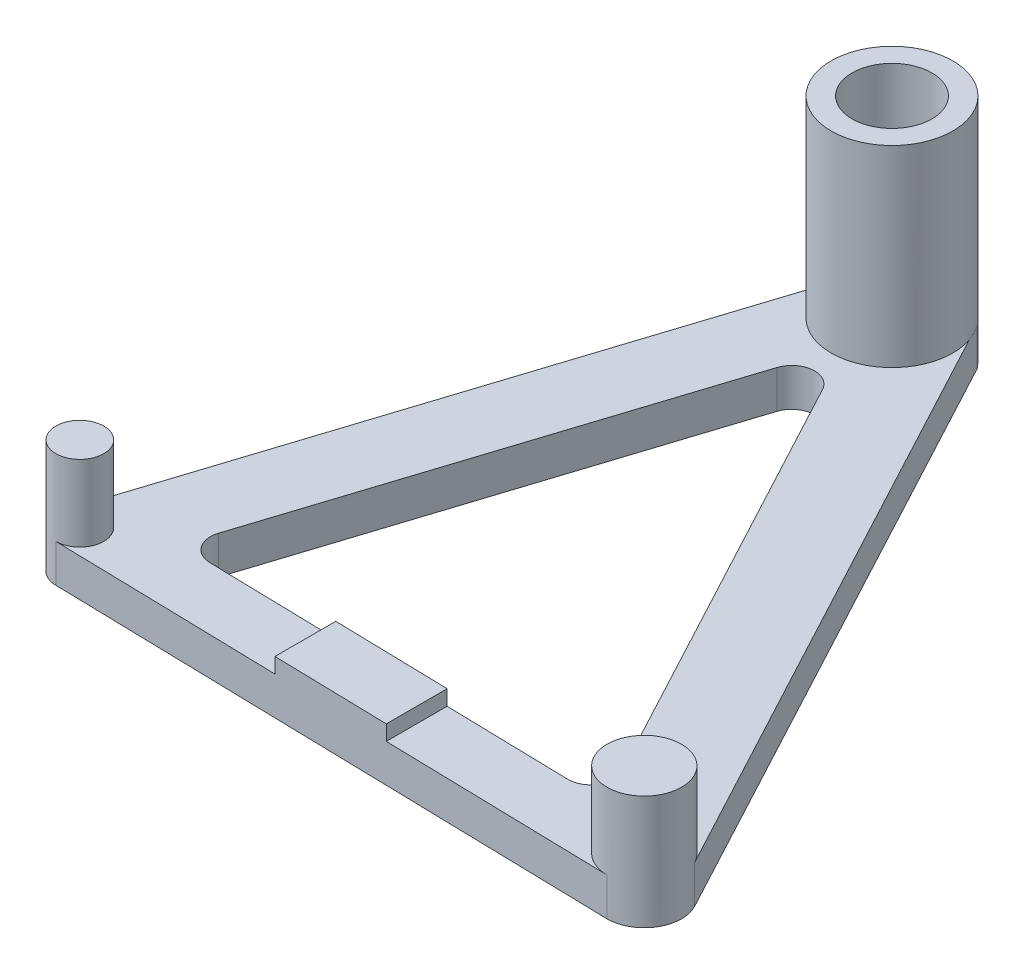
ISO-10303-21;
HEADER;
FILE_DESCRIPTION(('STEP AP214'),'2;1');
FILE_NAME('part.step','',(''),(''),'','','');
FILE_SCHEMA(('AUTOMOTIVE_DESIGN { 1 0 10303 214 1 1 1 1 }'));
ENDSEC;
DATA;
#1=APPLICATION_CONTEXT('core data for automotive mechanical design processes');
#2=APPLICATION_PROTOCOL_DEFINITION('international standard','automotive_design',2000,#1);
#3=PRODUCT_CONTEXT('',#1,'mechanical');
#4=PRODUCT('Part','Part','',(#3));
#5=PRODUCT_RELATED_PRODUCT_CATEGORY('part','',(#4));
#6=PRODUCT_DEFINITION_FORMATION('','',#4);
#7=PRODUCT_DEFINITION_CONTEXT('part definition',#1,'design');
#8=PRODUCT_DEFINITION('design','',#6,#7);
#9=PRODUCT_DEFINITION_SHAPE('','',#8);
#10=(LENGTH_UNIT() NAMED_UNIT(*) SI_UNIT(.MILLI.,.METRE.));
#11=(NAMED_UNIT(*) PLANE_ANGLE_UNIT() SI_UNIT($,.RADIAN.));
#12=(NAMED_UNIT(*) SI_UNIT($,.STERADIAN.) SOLID_ANGLE_UNIT());
#13=UNCERTAINTY_MEASURE_WITH_UNIT(LENGTH_MEASURE(1.E-05),#10,'distance_accuracy_value','');
#14=(GEOMETRIC_REPRESENTATION_CONTEXT(3) GLOBAL_UNCERTAINTY_ASSIGNED_CONTEXT((#13)) GLOBAL_UNIT_ASSIGNED_CONTEXT((#10,
#11,#12)) REPRESENTATION_CONTEXT('',''));
#15=CARTESIAN_POINT('',(0.,0.,0.));
#16=DIRECTION('',(0.,0.,1.));
#17=DIRECTION('',(1.,0.,0.));
#18=AXIS2_PLACEMENT_3D('',#15,#16,#17);
#19=CARTESIAN_POINT('',(0.,0.,0.));
#20=DIRECTION('',(0.,-1.,0.));
#21=DIRECTION('',(0.,0.,-1.));
#22=AXIS2_PLACEMENT_3D('',#19,#20,#21);
#23=PLANE('',#22);
#24=DIRECTION('',(0.,0.,1.));
#25=VECTOR('',#24,1.);
#26=CARTESIAN_POINT('',(-0.0266867237949386,0.,73.1403026304612));
#27=LINE('',#26,#25);
#28=CARTESIAN_POINT('',(-0.0266867237949386,0.,73.1403026304612));
#29=VERTEX_POINT('',#28);
#30=CARTESIAN_POINT('',(-0.0266867237949317,0.,81.1447466214371));
#31=VERTEX_POINT('',#30);
#32=EDGE_CURVE('E359',#29,#31,#27,.T.);
#33=ORIENTED_EDGE('',*,*,#32,.F.);
#34=DIRECTION('',(0.999722366227584,0.,0.0235624800120976));
#35=VECTOR('',#34,1.);
#36=CARTESIAN_POINT('',(36.3308666477732,0.,73.9972146627877));
#37=LINE('',#36,#35);
#38=CARTESIAN_POINT('',(-16.9948169162054,0.,72.740380370034));
#39=VERTEX_POINT('',#38);
#40=EDGE_CURVE('E160',#39,#29,#37,.T.);
#41=ORIENTED_EDGE('',*,*,#40,.F.);
#42=CARTESIAN_POINT('',(-16.9241294761691,0.,69.7412132713512));
#43=DIRECTION('',(0.,-1.,0.));
#44=DIRECTION('',(0.,0.,-1.));
#45=AXIS2_PLACEMENT_3D('',#42,#43,#44);
#46=CIRCLE('',#45,3.);
#47=CARTESIAN_POINT('',(-19.7806027640925,0.,68.8243924844031));
#48=VERTEX_POINT('',#47);
#49=EDGE_CURVE('E48',#39,#48,#46,.T.);
#50=ORIENTED_EDGE('',*,*,#49,.T.);
#51=DIRECTION('',(0.305606928982731,0.,-0.952157762641121));
#52=VECTOR('',#51,1.);
#53=CARTESIAN_POINT('',(2.09375374370878,0.,0.672016420772603));
#54=LINE('',#53,#52);
#55=CARTESIAN_POINT('',(-1.92874610163748,0.,13.2046329609741));
#56=VERTEX_POINT('',#55);
#57=EDGE_CURVE('E339',#48,#56,#54,.T.);
#58=ORIENTED_EDGE('',*,*,#57,.T.);
#59=CARTESIAN_POINT('',(0.927727186285879,0.,14.1214537479223));
#60=DIRECTION('',(0.,-1.,0.));
#61=DIRECTION('',(0.,0.,-1.));
#62=AXIS2_PLACEMENT_3D('',#59,#60,#61);
#63=CIRCLE('',#62,3.);
#64=CARTESIAN_POINT('',(3.57354097258041,0.,12.7073570722124));
#65=VERTEX_POINT('',#64);
#66=EDGE_CURVE('E76',#56,#65,#63,.T.);
#67=ORIENTED_EDGE('',*,*,#66,.T.);
#68=DIRECTION('',(-0.471365558569963,0.,-0.881937928764846));
#69=VECTOR('',#68,1.);
#70=CARTESIAN_POINT('',(0.235470884255557,0.,6.46173609663541));
#71=LINE('',#70,#69);
#72=CARTESIAN_POINT('',(33.9073810423125,0.,69.4628064176121));
#73=VERTEX_POINT('',#72);
#74=EDGE_CURVE('E140',#73,#65,#71,.T.);
#75=ORIENTED_EDGE('',*,*,#74,.F.);
#76=CARTESIAN_POINT('',(31.2615672560179,0.,70.876903093322));
#77=DIRECTION('',(0.,-1.,0.));
#78=DIRECTION('',(0.,0.,-1.));
#79=AXIS2_PLACEMENT_3D('',#76,#77,#78);
#80=CIRCLE('',#79,3.);
#81=CARTESIAN_POINT('',(31.1908798159816,0.,73.8760701920047));
#82=VERTEX_POINT('',#81);
#83=EDGE_CURVE('E134',#73,#82,#80,.T.);
#84=ORIENTED_EDGE('',*,*,#83,.T.);
#85=CARTESIAN_POINT('',(14.9733132762051,0.,73.4938379839965));
#86=VERTEX_POINT('',#85);
#87=EDGE_CURVE('E62',#86,#82,#37,.T.);
#88=ORIENTED_EDGE('',*,*,#87,.F.);
#89=DIRECTION('',(0.,0.,-1.));
#90=VECTOR('',#89,1.);
#91=CARTESIAN_POINT('',(14.9733132762051,0.,81.4982819749725));
#92=LINE('',#91,#90);
#93=CARTESIAN_POINT('',(14.9733132762051,0.,81.4982819749725));
#94=VERTEX_POINT('',#93);
#95=EDGE_CURVE('E352',#94,#86,#92,.T.);
#96=ORIENTED_EDGE('',*,*,#95,.F.);
#97=DIRECTION('',(0.999722366227584,0.,0.0235624800120979));
#98=VECTOR('',#97,1.);
#99=CARTESIAN_POINT('',(-1.91145545871687,0.,81.1003244627016));
#100=LINE('',#99,#98);
#101=CARTESIAN_POINT('',(44.4828891786728,0.,82.1937938649296));
#102=VERTEX_POINT('',#101);
#103=EDGE_CURVE('E42',#94,#102,#100,.T.);
#104=ORIENTED_EDGE('',*,*,#103,.T.);
#105=CARTESIAN_POINT('',(44.7137373737374,0.,77.29923473148));
#106=DIRECTION('',(0.,1.,0.));
#107=DIRECTION('',(0.,0.,1.));
#108=AXIS2_PLACEMENT_3D('',#105,#106,#107);
#109=CIRCLE('',#108,4.9);
#110=CARTESIAN_POINT('',(49.0352332246851,0.,74.9895434944872));
#111=VERTEX_POINT('',#110);
#112=EDGE_CURVE('E223',#111,#102,#109,.T.);
#113=ORIENTED_EDGE('',*,*,#112,.F.);
#114=DIRECTION('',(-0.471365558569963,0.,-0.881937928764846));
#115=VECTOR('',#114,1.);
#116=CARTESIAN_POINT('',(6.96602550959596,0.,-3.72310159054154));
#117=LINE('',#116,#115);
#118=CARTESIAN_POINT('',(7.56467891022886,0.,-2.60300460720657));
#119=VERTEX_POINT('',#118);
#120=EDGE_CURVE('E202',#111,#119,#117,.T.);
#121=ORIENTED_EDGE('',*,*,#120,.T.);
#122=CARTESIAN_POINT('',(0.,0.,0.));
#123=DIRECTION('',(0.,-1.,0.));
#124=DIRECTION('',(0.,0.,-1.));
#125=AXIS2_PLACEMENT_3D('',#122,#123,#124);
#126=CIRCLE('',#125,8.);
#127=CARTESIAN_POINT('',(-7.99925115845216,0.,-0.109457315889754));
#128=VERTEX_POINT('',#127);
#129=EDGE_CURVE('E244',#128,#119,#126,.F.);
#130=ORIENTED_EDGE('',*,*,#129,.F.);
#131=DIRECTION('',(0.305606928982731,0.,-0.95215776264112));
#132=VECTOR('',#131,1.);
#133=CARTESIAN_POINT('',(-7.28400688420454,0.,-2.33789300671788));
#134=LINE('',#133,#132);
#135=CARTESIAN_POINT('',(-32.5355595785822,0.,76.3365729051844));
#136=VERTEX_POINT('',#135);
#137=EDGE_CURVE('E186',#136,#128,#134,.T.);
#138=ORIENTED_EDGE('',*,*,#137,.F.);
#139=CARTESIAN_POINT('',(-29.5362626262627,0.,77.29923473148));
#140=DIRECTION('',(0.,1.,0.));
#141=DIRECTION('',(0.,0.,1.));
#142=AXIS2_PLACEMENT_3D('',#139,#140,#141);
#143=CIRCLE('',#142,3.15);
#144=CARTESIAN_POINT('',(-29.5362626262627,0.,80.44923473148));
#145=VERTEX_POINT('',#144);
#146=EDGE_CURVE('E176',#145,#136,#143,.T.);
#147=ORIENTED_EDGE('',*,*,#146,.F.);
#148=EDGE_CURVE('E207',#145,#31,#100,.T.);
#149=ORIENTED_EDGE('',*,*,#148,.T.);
#150=EDGE_LOOP('',(#33,#41,#50,#58,#67,#75,#84,#88,#96,#104,#113,#121,#130,#138,#147,#149));
#151=FACE_BOUND('',#150,.T.);
#152=ADVANCED_FACE('F38',(#151),#23,.F.);
#153=CARTESIAN_POINT('',(44.7137373737374,25.3,77.29923473148));
#154=DIRECTION('',(0.,-1.,0.));
#155=DIRECTION('',(0.,0.,-1.));
#156=AXIS2_PLACEMENT_3D('',#153,#154,#155);
#157=CYLINDRICAL_SURFACE('',#156,4.9);
#158=CARTESIAN_POINT('',(44.7137373737374,10.,77.29923473148));
#159=DIRECTION('',(0.,-1.,0.));
#160=DIRECTION('',(0.,0.,-1.));
#161=AXIS2_PLACEMENT_3D('',#158,#159,#160);
#162=CIRCLE('',#161,4.9);
#163=CARTESIAN_POINT('',(44.7137373737374,10.,72.39923473148));
#164=VERTEX_POINT('',#163);
#165=EDGE_CURVE('E166',#164,#164,#162,.T.);
#166=ORIENTED_EDGE('',*,*,#165,.T.);
#167=EDGE_LOOP('',(#166));
#168=FACE_BOUND('',#167,.T.);
#169=CARTESIAN_POINT('',(44.7137373737374,0.,77.29923473148));
#170=DIRECTION('',(0.,1.,0.));
#171=DIRECTION('',(-0.0471118765437864,0.,0.998889619071358));
#172=AXIS2_PLACEMENT_3D('',#169,#170,#171);
#173=CIRCLE('',#172,4.90000000000001);
#174=CARTESIAN_POINT('',(44.7137373737374,0.,82.19923473148));
#175=VERTEX_POINT('',#174);
#176=EDGE_CURVE('E232',#102,#175,#173,.T.);
#177=ORIENTED_EDGE('',*,*,#176,.T.);
#178=DIRECTION('',(0.,1.,0.));
#179=VECTOR('',#178,1.);
#180=CARTESIAN_POINT('',(44.7137373737374,-5.,82.19923473148));
#181=LINE('',#180,#179);
#182=CARTESIAN_POINT('',(44.7137373737374,-5.,82.19923473148));
#183=VERTEX_POINT('',#182);
#184=EDGE_CURVE('E219',#183,#175,#181,.T.);
#185=ORIENTED_EDGE('',*,*,#184,.F.);
#186=CARTESIAN_POINT('',(44.7137373737374,-5.,77.29923473148));
#187=DIRECTION('',(0.,-1.,0.));
#188=DIRECTION('',(0.,0.,-1.));
#189=AXIS2_PLACEMENT_3D('',#186,#187,#188);
#190=CIRCLE('',#189,4.90000000000001);
#191=CARTESIAN_POINT('',(49.0352332246851,-5.,74.9895434944872));
#192=VERTEX_POINT('',#191);
#193=EDGE_CURVE('E185',#192,#183,#190,.T.);
#194=ORIENTED_EDGE('',*,*,#193,.F.);
#195=DIRECTION('',(0.,1.,0.));
#196=VECTOR('',#195,1.);
#197=CARTESIAN_POINT('',(49.0352332246851,-5.,74.9895434944872));
#198=LINE('',#197,#196);
#199=EDGE_CURVE('E220',#192,#111,#198,.T.);
#200=ORIENTED_EDGE('',*,*,#199,.T.);
#201=ORIENTED_EDGE('',*,*,#112,.T.);
#202=EDGE_LOOP('',(#177,#185,#194,#200,#201));
#203=FACE_BOUND('',#202,.T.);
#204=ADVANCED_FACE('F246',(#168,#203),#157,.T.);
#205=CARTESIAN_POINT('',(6.96602550959596,-5.,-3.72310159054154));
#206=DIRECTION('',(0.881937928764846,0.,-0.471365558569963));
#207=DIRECTION('',(-0.471365558569963,0.,-0.881937928764846));
#208=AXIS2_PLACEMENT_3D('',#205,#206,#207);
#209=PLANE('',#208);
#210=ORIENTED_EDGE('',*,*,#120,.F.);
#211=ORIENTED_EDGE('',*,*,#199,.F.);
#212=DIRECTION('',(-0.471365558569963,0.,-0.881937928764846));
#213=VECTOR('',#212,1.);
#214=CARTESIAN_POINT('',(6.96602550959596,-5.,-3.72310159054154));
#215=LINE('',#214,#213);
#216=CARTESIAN_POINT('',(6.36737210896305,-5.,-4.84319857387651));
#217=VERTEX_POINT('',#216);
#218=EDGE_CURVE('E182',#192,#217,#215,.T.);
#219=ORIENTED_EDGE('',*,*,#218,.T.);
#220=DIRECTION('',(0.,1.,0.));
#221=VECTOR('',#220,1.);
#222=CARTESIAN_POINT('',(6.36737210896305,-5.,-4.84319857387651));
#223=LINE('',#222,#221);
#224=CARTESIAN_POINT('',(6.36737210896305,0.,-4.84319857387651));
#225=VERTEX_POINT('',#224);
#226=EDGE_CURVE('E201',#217,#225,#223,.T.);
#227=ORIENTED_EDGE('',*,*,#226,.T.);
#228=EDGE_CURVE('E181',#119,#225,#117,.T.);
#229=ORIENTED_EDGE('',*,*,#228,.F.);
#230=EDGE_LOOP('',(#210,#211,#219,#227,#229));
#231=FACE_BOUND('',#230,.T.);
#232=ADVANCED_FACE('F256',(#231),#209,.T.);
#233=CARTESIAN_POINT('',(-1.91145545871687,-5.,81.1003244627016));
#234=DIRECTION('',(-0.0235624800120979,0.,0.999722366227584));
#235=DIRECTION('',(0.999722366227584,0.,0.0235624800120979));
#236=AXIS2_PLACEMENT_3D('',#233,#234,#235);
#237=PLANE('',#236);
#238=ORIENTED_EDGE('',*,*,#148,.F.);
#239=DIRECTION('',(0.,1.,0.));
#240=VECTOR('',#239,1.);
#241=CARTESIAN_POINT('',(-29.5362626262627,-5.,80.44923473148));
#242=LINE('',#241,#240);
#243=CARTESIAN_POINT('',(-29.5362626262627,-5.,80.44923473148));
#244=VERTEX_POINT('',#243);
#245=EDGE_CURVE('E216',#244,#145,#242,.T.);
#246=ORIENTED_EDGE('',*,*,#245,.F.);
#247=DIRECTION('',(0.999722366227584,0.,0.0235624800120979));
#248=VECTOR('',#247,1.);
#249=CARTESIAN_POINT('',(-1.91145545871687,-5.,81.1003244627016));
#250=LINE('',#249,#248);
#251=EDGE_CURVE('E189',#244,#183,#250,.T.);
#252=ORIENTED_EDGE('',*,*,#251,.T.);
#253=ORIENTED_EDGE('',*,*,#184,.T.);
#254=ORIENTED_EDGE('',*,*,#176,.F.);
#255=ORIENTED_EDGE('',*,*,#103,.F.);
#256=DIRECTION('',(0.,-1.,0.));
#257=VECTOR('',#256,1.);
#258=CARTESIAN_POINT('',(14.9733132762051,2.,81.4982819749725));
#259=LINE('',#258,#257);
#260=CARTESIAN_POINT('',(14.9733132762051,2.,81.4982819749725));
#261=VERTEX_POINT('',#260);
#262=EDGE_CURVE('E156',#261,#94,#259,.T.);
#263=ORIENTED_EDGE('',*,*,#262,.F.);
#264=DIRECTION('',(0.999722366227584,0.,0.0235624800120981));
#265=VECTOR('',#264,1.);
#266=CARTESIAN_POINT('',(-0.0266867237949317,2.,81.1447466214371));
#267=LINE('',#266,#265);
#268=CARTESIAN_POINT('',(-0.0266867237949317,2.,81.1447466214371));
#269=VERTEX_POINT('',#268);
#270=EDGE_CURVE('E367',#269,#261,#267,.T.);
#271=ORIENTED_EDGE('',*,*,#270,.F.);
#272=DIRECTION('',(0.,-1.,0.));
#273=VECTOR('',#272,1.);
#274=CARTESIAN_POINT('',(-0.0266867237949317,2.,81.1447466214371));
#275=LINE('',#274,#273);
#276=EDGE_CURVE('E147',#269,#31,#275,.T.);
#277=ORIENTED_EDGE('',*,*,#276,.T.);
#278=EDGE_LOOP('',(#238,#246,#252,#253,#254,#255,#263,#271,#277));
#279=FACE_BOUND('',#278,.T.);
#280=ADVANCED_FACE('F286',(#279),#237,.T.);
#281=CARTESIAN_POINT('',(-29.5362626262627,-5.,77.29923473148));
#282=DIRECTION('',(0.,1.,0.));
#283=DIRECTION('',(0.,0.,1.));
#284=AXIS2_PLACEMENT_3D('',#281,#282,#283);
#285=CYLINDRICAL_SURFACE('',#284,3.15);
#286=CARTESIAN_POINT('',(-29.5362626262627,10.,77.29923473148));
#287=DIRECTION('',(0.,-1.,0.));
#288=DIRECTION('',(0.,0.,-1.));
#289=AXIS2_PLACEMENT_3D('',#286,#287,#288);
#290=CIRCLE('',#289,3.15);
#291=CARTESIAN_POINT('',(-29.5362626262627,10.,74.14923473148));
#292=VERTEX_POINT('',#291);
#293=EDGE_CURVE('E165',#292,#292,#290,.T.);
#294=ORIENTED_EDGE('',*,*,#293,.T.);
#295=EDGE_LOOP('',(#294));
#296=FACE_BOUND('',#295,.T.);
#297=ORIENTED_EDGE('',*,*,#245,.T.);
#298=ORIENTED_EDGE('',*,*,#146,.T.);
#299=DIRECTION('',(0.,1.,0.));
#300=VECTOR('',#299,1.);
#301=CARTESIAN_POINT('',(-32.5355595785822,-5.,76.3365729051844));
#302=LINE('',#301,#300);
#303=CARTESIAN_POINT('',(-32.5355595785822,-5.,76.3365729051844));
#304=VERTEX_POINT('',#303);
#305=EDGE_CURVE('E213',#304,#136,#302,.T.);
#306=ORIENTED_EDGE('',*,*,#305,.F.);
#307=CARTESIAN_POINT('',(-29.5362626262627,-5.,77.29923473148));
#308=DIRECTION('',(0.,-1.,0.));
#309=DIRECTION('',(0.,0.,-1.));
#310=AXIS2_PLACEMENT_3D('',#307,#308,#309);
#311=CIRCLE('',#310,3.15);
#312=EDGE_CURVE('E192',#244,#304,#311,.T.);
#313=ORIENTED_EDGE('',*,*,#312,.F.);
#314=EDGE_LOOP('',(#297,#298,#306,#313));
#315=FACE_BOUND('',#314,.T.);
#316=ADVANCED_FACE('F283',(#296,#315),#285,.T.);
#317=CARTESIAN_POINT('',(-7.28400688420454,-5.,-2.33789300671788));
#318=DIRECTION('',(0.95215776264112,0.,0.305606928982731));
#319=DIRECTION('',(0.305606928982731,0.,-0.95215776264112));
#320=AXIS2_PLACEMENT_3D('',#317,#318,#319);
#321=PLANE('',#320);
#322=ORIENTED_EDGE('',*,*,#137,.T.);
#323=DIRECTION('',(0.,1.,0.));
#324=VECTOR('',#323,1.);
#325=CARTESIAN_POINT('',(-7.99925115845216,-5.,-0.109457315889754));
#326=LINE('',#325,#324);
#327=CARTESIAN_POINT('',(-7.99925115845216,-5.,-0.109457315889754));
#328=VERTEX_POINT('',#327);
#329=EDGE_CURVE('E210',#328,#128,#326,.T.);
#330=ORIENTED_EDGE('',*,*,#329,.F.);
#331=DIRECTION('',(0.305606928982731,0.,-0.95215776264112));
#332=VECTOR('',#331,1.);
#333=CARTESIAN_POINT('',(-7.28400688420454,-5.,-2.33789300671788));
#334=LINE('',#333,#332);
#335=EDGE_CURVE('E195',#304,#328,#334,.T.);
#336=ORIENTED_EDGE('',*,*,#335,.F.);
#337=ORIENTED_EDGE('',*,*,#305,.T.);
#338=EDGE_LOOP('',(#322,#330,#336,#337));
#339=FACE_BOUND('',#338,.T.);
#340=ADVANCED_FACE('F279',(#339),#321,.F.);
#341=CARTESIAN_POINT('',(0.,-5.,0.));
#342=DIRECTION('',(0.,1.,0.));
#343=DIRECTION('',(0.,0.,1.));
#344=AXIS2_PLACEMENT_3D('',#341,#342,#343);
#345=CYLINDRICAL_SURFACE('',#344,8.);
#346=ORIENTED_EDGE('',*,*,#329,.T.);
#347=ORIENTED_EDGE('',*,*,#129,.T.);
#348=CARTESIAN_POINT('',(0.,0.,0.));
#349=DIRECTION('',(0.,1.,0.));
#350=DIRECTION('',(0.,0.,1.));
#351=AXIS2_PLACEMENT_3D('',#348,#349,#350);
#352=CIRCLE('',#351,8.);
#353=EDGE_CURVE('E172',#119,#225,#352,.T.);
#354=ORIENTED_EDGE('',*,*,#353,.T.);
#355=ORIENTED_EDGE('',*,*,#226,.F.);
#356=CARTESIAN_POINT('',(0.,-5.,0.));
#357=DIRECTION('',(0.,-1.,0.));
#358=DIRECTION('',(0.,0.,-1.));
#359=AXIS2_PLACEMENT_3D('',#356,#357,#358);
#360=CIRCLE('',#359,8.);
#361=EDGE_CURVE('E198',#328,#217,#360,.T.);
#362=ORIENTED_EDGE('',*,*,#361,.F.);
#363=EDGE_LOOP('',(#346,#347,#354,#355,#362));
#364=FACE_BOUND('',#363,.T.);
#365=CARTESIAN_POINT('',(0.,25.3,0.));
#366=DIRECTION('',(0.,1.,0.));
#367=DIRECTION('',(0.,0.,1.));
#368=AXIS2_PLACEMENT_3D('',#365,#366,#367);
#369=CIRCLE('',#368,8.);
#370=CARTESIAN_POINT('',(0.,25.3,8.));
#371=VERTEX_POINT('',#370);
#372=EDGE_CURVE('E173',#371,#371,#369,.T.);
#373=ORIENTED_EDGE('',*,*,#372,.F.);
#374=EDGE_LOOP('',(#373));
#375=FACE_BOUND('',#374,.T.);
#376=ADVANCED_FACE('F276',(#364,#375),#345,.T.);
#377=CARTESIAN_POINT('',(0.,-5.,0.));
#378=DIRECTION('',(0.,-1.,0.));
#379=DIRECTION('',(0.,0.,-1.));
#380=AXIS2_PLACEMENT_3D('',#377,#378,#379);
#381=PLANE('',#380);
#382=CARTESIAN_POINT('',(0.,-5.,0.));
#383=DIRECTION('',(0.,-1.,0.));
#384=DIRECTION('',(0.,0.,-1.));
#385=AXIS2_PLACEMENT_3D('',#382,#383,#384);
#386=CIRCLE('',#385,5.25);
#387=CARTESIAN_POINT('',(0.,-5.,-5.25));
#388=VERTEX_POINT('',#387);
#389=EDGE_CURVE('E138',#388,#388,#386,.T.);
#390=ORIENTED_EDGE('',*,*,#389,.F.);
#391=EDGE_LOOP('',(#390));
#392=FACE_BOUND('',#391,.T.);
#393=DIRECTION('',(0.471365558569963,0.,0.881937928764846));
#394=VECTOR('',#393,1.);
#395=CARTESIAN_POINT('',(-2.5030890133252,-5.,1.33781518226433));
#396=LINE('',#395,#394);
#397=CARTESIAN_POINT('',(3.57354097258042,-5.,12.7073570722124));
#398=VERTEX_POINT('',#397);
#399=CARTESIAN_POINT('',(33.9073810423125,-5.,69.4628064176121));
#400=VERTEX_POINT('',#399);
#401=EDGE_CURVE('E122',#398,#400,#396,.T.);
#402=ORIENTED_EDGE('',*,*,#401,.F.);
#403=CARTESIAN_POINT('',(0.927727186285879,-5.,14.1214537479223));
#404=DIRECTION('',(0.,-1.,0.));
#405=DIRECTION('',(0.,0.,-1.));
#406=AXIS2_PLACEMENT_3D('',#403,#404,#405);
#407=CIRCLE('',#406,3.);
#408=CARTESIAN_POINT('',(-1.92874610163748,-5.,13.2046329609741));
#409=VERTEX_POINT('',#408);
#410=EDGE_CURVE('E132',#398,#409,#407,.F.);
#411=ORIENTED_EDGE('',*,*,#410,.T.);
#412=DIRECTION('',(0.305606928982731,0.,-0.952157762641121));
#413=VECTOR('',#412,1.);
#414=CARTESIAN_POINT('',(2.09375374370878,-5.,0.672016420772603));
#415=LINE('',#414,#413);
#416=CARTESIAN_POINT('',(-19.7806027640925,-5.,68.8243924844031));
#417=VERTEX_POINT('',#416);
#418=EDGE_CURVE('E112',#417,#409,#415,.T.);
#419=ORIENTED_EDGE('',*,*,#418,.F.);
#420=CARTESIAN_POINT('',(-16.9241294761691,-5.,69.7412132713512));
#421=DIRECTION('',(0.,-1.,0.));
#422=DIRECTION('',(0.,0.,-1.));
#423=AXIS2_PLACEMENT_3D('',#420,#421,#422);
#424=CIRCLE('',#423,3.);
#425=CARTESIAN_POINT('',(-16.9948169162054,-5.,72.740380370034));
#426=VERTEX_POINT('',#425);
#427=EDGE_CURVE('E13',#417,#426,#424,.F.);
#428=ORIENTED_EDGE('',*,*,#427,.T.);
#429=DIRECTION('',(-0.999722366227584,0.,-0.0235624800120976));
#430=VECTOR('',#429,1.);
#431=CARTESIAN_POINT('',(-1.72290327016466,-5.,73.1003244627016));
#432=LINE('',#431,#430);
#433=CARTESIAN_POINT('',(31.1908798159816,-5.,73.8760701920047));
#434=VERTEX_POINT('',#433);
#435=EDGE_CURVE('E109',#434,#426,#432,.T.);
#436=ORIENTED_EDGE('',*,*,#435,.F.);
#437=CARTESIAN_POINT('',(31.2615672560179,-5.,70.876903093322));
#438=DIRECTION('',(0.,-1.,0.));
#439=DIRECTION('',(0.,0.,-1.));
#440=AXIS2_PLACEMENT_3D('',#437,#438,#439);
#441=CIRCLE('',#440,3.);
#442=EDGE_CURVE('E136',#434,#400,#441,.F.);
#443=ORIENTED_EDGE('',*,*,#442,.T.);
#444=EDGE_LOOP('',(#402,#411,#419,#428,#436,#443));
#445=FACE_BOUND('',#444,.T.);
#446=ORIENTED_EDGE('',*,*,#218,.F.);
#447=ORIENTED_EDGE('',*,*,#193,.T.);
#448=ORIENTED_EDGE('',*,*,#251,.F.);
#449=ORIENTED_EDGE('',*,*,#312,.T.);
#450=ORIENTED_EDGE('',*,*,#335,.T.);
#451=ORIENTED_EDGE('',*,*,#361,.T.);
#452=EDGE_LOOP('',(#446,#447,#448,#449,#450,#451));
#453=FACE_BOUND('',#452,.T.);
#454=ADVANCED_FACE('F107',(#392,#445,#453),#381,.T.);
#455=CARTESIAN_POINT('',(0.,25.3,0.));
#456=DIRECTION('',(0.,1.,0.));
#457=DIRECTION('',(0.,0.,1.));
#458=AXIS2_PLACEMENT_3D('',#455,#456,#457);
#459=PLANE('',#458);
#460=ORIENTED_EDGE('',*,*,#372,.T.);
#461=EDGE_LOOP('',(#460));
#462=FACE_BOUND('',#461,.T.);
#463=CARTESIAN_POINT('',(0.,25.3,0.));
#464=DIRECTION('',(0.,1.,0.));
#465=DIRECTION('',(0.,0.,1.));
#466=AXIS2_PLACEMENT_3D('',#463,#464,#465);
#467=CIRCLE('',#466,5.25);
#468=CARTESIAN_POINT('',(0.,25.3,5.25));
#469=VERTEX_POINT('',#468);
#470=EDGE_CURVE('E169',#469,#469,#467,.T.);
#471=ORIENTED_EDGE('',*,*,#470,.F.);
#472=EDGE_LOOP('',(#471));
#473=FACE_BOUND('',#472,.T.);
#474=ADVANCED_FACE('F390',(#462,#473),#459,.T.);
#475=CARTESIAN_POINT('',(0.,0.,0.));
#476=DIRECTION('',(0.,1.,0.));
#477=DIRECTION('',(0.,0.,1.));
#478=AXIS2_PLACEMENT_3D('',#475,#476,#477);
#479=PLANE('',#478);
#480=ORIENTED_EDGE('',*,*,#228,.T.);
#481=ORIENTED_EDGE('',*,*,#353,.F.);
#482=EDGE_LOOP('',(#480,#481));
#483=FACE_BOUND('',#482,.T.);
#484=ADVANCED_FACE('F395',(#483),#479,.F.);
#485=CARTESIAN_POINT('',(0.,25.3,0.));
#486=DIRECTION('',(0.,-1.,0.));
#487=DIRECTION('',(0.,0.,-1.));
#488=AXIS2_PLACEMENT_3D('',#485,#486,#487);
#489=CYLINDRICAL_SURFACE('',#488,5.25);
#490=ORIENTED_EDGE('',*,*,#470,.T.);
#491=EDGE_LOOP('',(#490));
#492=FACE_BOUND('',#491,.T.);
#493=ORIENTED_EDGE('',*,*,#389,.T.);
#494=EDGE_LOOP('',(#493));
#495=FACE_BOUND('',#494,.T.);
#496=ADVANCED_FACE('F401',(#492,#495),#489,.F.);
#497=CARTESIAN_POINT('',(0.,10.,0.));
#498=DIRECTION('',(0.,-1.,0.));
#499=DIRECTION('',(0.,0.,-1.));
#500=AXIS2_PLACEMENT_3D('',#497,#498,#499);
#501=PLANE('',#500);
#502=ORIENTED_EDGE('',*,*,#293,.F.);
#503=EDGE_LOOP('',(#502));
#504=FACE_BOUND('',#503,.T.);
#505=ADVANCED_FACE('F407',(#504),#501,.F.);
#506=ORIENTED_EDGE('',*,*,#165,.F.);
#507=EDGE_LOOP('',(#506));
#508=FACE_BOUND('',#507,.T.);
#509=ADVANCED_FACE('F409',(#508),#501,.F.);
#510=CARTESIAN_POINT('',(0.235470884255557,-5.000025,6.46173609663541));
#511=DIRECTION('',(0.881937928764846,0.,-0.471365558569963));
#512=DIRECTION('',(-0.471365558569963,0.,-0.881937928764846));
#513=AXIS2_PLACEMENT_3D('',#510,#511,#512);
#514=PLANE('',#513);
#515=ORIENTED_EDGE('',*,*,#74,.T.);
#516=DIRECTION('',(0.,1.,0.));
#517=VECTOR('',#516,1.);
#518=CARTESIAN_POINT('',(3.57354097258041,-5.,12.7073570722124));
#519=LINE('',#518,#517);
#520=EDGE_CURVE('E124',#65,#398,#519,.F.);
#521=ORIENTED_EDGE('',*,*,#520,.T.);
#522=ORIENTED_EDGE('',*,*,#401,.T.);
#523=DIRECTION('',(0.,1.,0.));
#524=VECTOR('',#523,1.);
#525=CARTESIAN_POINT('',(33.9073810423125,0.,69.4628064176121));
#526=LINE('',#525,#524);
#527=EDGE_CURVE('E127',#400,#73,#526,.T.);
#528=ORIENTED_EDGE('',*,*,#527,.T.);
#529=EDGE_LOOP('',(#515,#521,#522,#528));
#530=FACE_BOUND('',#529,.T.);
#531=ADVANCED_FACE('F348',(#530),#514,.F.);
#532=CARTESIAN_POINT('',(36.3308666477732,-5.000025,73.9972146627877));
#533=DIRECTION('',(-0.0235624800120976,0.,0.999722366227584));
#534=DIRECTION('',(0.999722366227584,0.,0.0235624800120976));
#535=AXIS2_PLACEMENT_3D('',#532,#533,#534);
#536=PLANE('',#535);
#537=ORIENTED_EDGE('',*,*,#40,.T.);
#538=DIRECTION('',(0.,-1.,0.));
#539=VECTOR('',#538,1.);
#540=CARTESIAN_POINT('',(-0.0266867237949386,2.,73.1403026304612));
#541=LINE('',#540,#539);
#542=CARTESIAN_POINT('',(-0.0266867237949386,2.,73.1403026304612));
#543=VERTEX_POINT('',#542);
#544=EDGE_CURVE('E141',#543,#29,#541,.T.);
#545=ORIENTED_EDGE('',*,*,#544,.F.);
#546=DIRECTION('',(-0.999722366227584,0.,-0.0235624800120962));
#547=VECTOR('',#546,1.);
#548=CARTESIAN_POINT('',(14.9733132762051,2.,73.4938379839965));
#549=LINE('',#548,#547);
#550=CARTESIAN_POINT('',(14.9733132762051,2.,73.4938379839965));
#551=VERTEX_POINT('',#550);
#552=EDGE_CURVE('E358',#551,#543,#549,.T.);
#553=ORIENTED_EDGE('',*,*,#552,.F.);
#554=DIRECTION('',(0.,-1.,0.));
#555=VECTOR('',#554,1.);
#556=CARTESIAN_POINT('',(14.9733132762051,2.,73.4938379839965));
#557=LINE('',#556,#555);
#558=EDGE_CURVE('E56',#551,#86,#557,.T.);
#559=ORIENTED_EDGE('',*,*,#558,.T.);
#560=ORIENTED_EDGE('',*,*,#87,.T.);
#561=DIRECTION('',(0.,1.,0.));
#562=VECTOR('',#561,1.);
#563=CARTESIAN_POINT('',(31.1908798159816,-5.,73.8760701920047));
#564=LINE('',#563,#562);
#565=EDGE_CURVE('E121',#82,#434,#564,.F.);
#566=ORIENTED_EDGE('',*,*,#565,.T.);
#567=ORIENTED_EDGE('',*,*,#435,.T.);
#568=DIRECTION('',(0.,1.,0.));
#569=VECTOR('',#568,1.);
#570=CARTESIAN_POINT('',(-16.9948169162054,0.,72.740380370034));
#571=LINE('',#570,#569);
#572=EDGE_CURVE('E119',#426,#39,#571,.T.);
#573=ORIENTED_EDGE('',*,*,#572,.T.);
#574=EDGE_LOOP('',(#537,#545,#553,#559,#560,#566,#567,#573));
#575=FACE_BOUND('',#574,.T.);
#576=ADVANCED_FACE('F118',(#575),#536,.F.);
#577=CARTESIAN_POINT('',(-21.0071357182587,-5.000025,72.645813933622));
#578=DIRECTION('',(-0.95215776264112,0.,-0.305606928982731));
#579=DIRECTION('',(-0.305606928982731,0.,0.952157762641121));
#580=AXIS2_PLACEMENT_3D('',#577,#578,#579);
#581=PLANE('',#580);
#582=ORIENTED_EDGE('',*,*,#418,.T.);
#583=DIRECTION('',(0.,1.,0.));
#584=VECTOR('',#583,1.);
#585=CARTESIAN_POINT('',(-1.92874610163748,0.,13.2046329609741));
#586=LINE('',#585,#584);
#587=EDGE_CURVE('E340',#409,#56,#586,.T.);
#588=ORIENTED_EDGE('',*,*,#587,.T.);
#589=ORIENTED_EDGE('',*,*,#57,.F.);
#590=DIRECTION('',(0.,1.,0.));
#591=VECTOR('',#590,1.);
#592=CARTESIAN_POINT('',(-19.7806027640925,-5.,68.8243924844031));
#593=LINE('',#592,#591);
#594=EDGE_CURVE('E338',#48,#417,#593,.F.);
#595=ORIENTED_EDGE('',*,*,#594,.T.);
#596=EDGE_LOOP('',(#582,#588,#589,#595));
#597=FACE_BOUND('',#596,.T.);
#598=ADVANCED_FACE('F262',(#597),#581,.F.);
#599=CARTESIAN_POINT('',(0.927727186285879,-5.000025,14.1214537479223));
#600=DIRECTION('',(0.,-1.,0.));
#601=DIRECTION('',(0.,0.,-1.));
#602=AXIS2_PLACEMENT_3D('',#599,#600,#601);
#603=CYLINDRICAL_SURFACE('',#602,3.);
#604=ORIENTED_EDGE('',*,*,#410,.F.);
#605=ORIENTED_EDGE('',*,*,#520,.F.);
#606=ORIENTED_EDGE('',*,*,#66,.F.);
#607=ORIENTED_EDGE('',*,*,#587,.F.);
#608=EDGE_LOOP('',(#604,#605,#606,#607));
#609=FACE_BOUND('',#608,.T.);
#610=ADVANCED_FACE('F259',(#609),#603,.F.);
#611=CARTESIAN_POINT('',(31.2615672560179,-5.000025,70.876903093322));
#612=DIRECTION('',(0.,-1.,0.));
#613=DIRECTION('',(0.,0.,-1.));
#614=AXIS2_PLACEMENT_3D('',#611,#612,#613);
#615=CYLINDRICAL_SURFACE('',#614,3.);
#616=ORIENTED_EDGE('',*,*,#442,.F.);
#617=ORIENTED_EDGE('',*,*,#565,.F.);
#618=ORIENTED_EDGE('',*,*,#83,.F.);
#619=ORIENTED_EDGE('',*,*,#527,.F.);
#620=EDGE_LOOP('',(#616,#617,#618,#619));
#621=FACE_BOUND('',#620,.T.);
#622=ADVANCED_FACE('F261',(#621),#615,.F.);
#623=CARTESIAN_POINT('',(-16.9241294761691,-5.000025,69.7412132713512));
#624=DIRECTION('',(0.,-1.,0.));
#625=DIRECTION('',(0.,0.,-1.));
#626=AXIS2_PLACEMENT_3D('',#623,#624,#625);
#627=CYLINDRICAL_SURFACE('',#626,3.);
#628=ORIENTED_EDGE('',*,*,#427,.F.);
#629=ORIENTED_EDGE('',*,*,#594,.F.);
#630=ORIENTED_EDGE('',*,*,#49,.F.);
#631=ORIENTED_EDGE('',*,*,#572,.F.);
#632=EDGE_LOOP('',(#628,#629,#630,#631));
#633=FACE_BOUND('',#632,.T.);
#634=ADVANCED_FACE('F40',(#633),#627,.F.);
#635=CARTESIAN_POINT('',(-0.0266867237949386,2.,73.1403026304612));
#636=DIRECTION('',(1.,0.,0.));
#637=DIRECTION('',(0.,0.,-1.));
#638=AXIS2_PLACEMENT_3D('',#635,#636,#637);
#639=PLANE('',#638);
#640=ORIENTED_EDGE('',*,*,#32,.T.);
#641=ORIENTED_EDGE('',*,*,#276,.F.);
#642=DIRECTION('',(0.,0.,1.));
#643=VECTOR('',#642,1.);
#644=CARTESIAN_POINT('',(-0.0266867237949386,2.,73.1403026304612));
#645=LINE('',#644,#643);
#646=EDGE_CURVE('E377',#543,#269,#645,.T.);
#647=ORIENTED_EDGE('',*,*,#646,.F.);
#648=ORIENTED_EDGE('',*,*,#544,.T.);
#649=EDGE_LOOP('',(#640,#641,#647,#648));
#650=FACE_BOUND('',#649,.T.);
#651=ADVANCED_FACE('F268',(#650),#639,.F.);
#652=CARTESIAN_POINT('',(14.9733132762051,2.,81.4982819749725));
#653=DIRECTION('',(-1.,0.,0.));
#654=DIRECTION('',(0.,0.,1.));
#655=AXIS2_PLACEMENT_3D('',#652,#653,#654);
#656=PLANE('',#655);
#657=ORIENTED_EDGE('',*,*,#95,.T.);
#658=ORIENTED_EDGE('',*,*,#558,.F.);
#659=DIRECTION('',(0.,0.,-1.));
#660=VECTOR('',#659,1.);
#661=CARTESIAN_POINT('',(14.9733132762051,2.,81.4982819749725));
#662=LINE('',#661,#660);
#663=EDGE_CURVE('E371',#261,#551,#662,.T.);
#664=ORIENTED_EDGE('',*,*,#663,.F.);
#665=ORIENTED_EDGE('',*,*,#262,.T.);
#666=EDGE_LOOP('',(#657,#658,#664,#665));
#667=FACE_BOUND('',#666,.T.);
#668=ADVANCED_FACE('F372',(#667),#656,.F.);
#669=CARTESIAN_POINT('',(0.,2.,0.));
#670=DIRECTION('',(0.,1.,0.));
#671=DIRECTION('',(0.,0.,1.));
#672=AXIS2_PLACEMENT_3D('',#669,#670,#671);
#673=PLANE('',#672);
#674=ORIENTED_EDGE('',*,*,#552,.T.);
#675=ORIENTED_EDGE('',*,*,#646,.T.);
#676=ORIENTED_EDGE('',*,*,#270,.T.);
#677=ORIENTED_EDGE('',*,*,#663,.T.);
#678=EDGE_LOOP('',(#674,#675,#676,#677));
#679=FACE_BOUND('',#678,.T.);
#680=ADVANCED_FACE('F423',(#679),#673,.T.);
#681=CLOSED_SHELL('',(#152,#204,#232,#280,#316,#340,#376,#454,#474,#484,#496,#505,#509,#531,
#576,#598,#610,#622,#634,#651,#668,#680));
#682=MANIFOLD_SOLID_BREP('B2',#681);
#683=ADVANCED_BREP_SHAPE_REPRESENTATION('',(#18,#682),#14);
#684=SHAPE_DEFINITION_REPRESENTATION(#9,#683);
ENDSEC;
END-ISO-10303-21;
